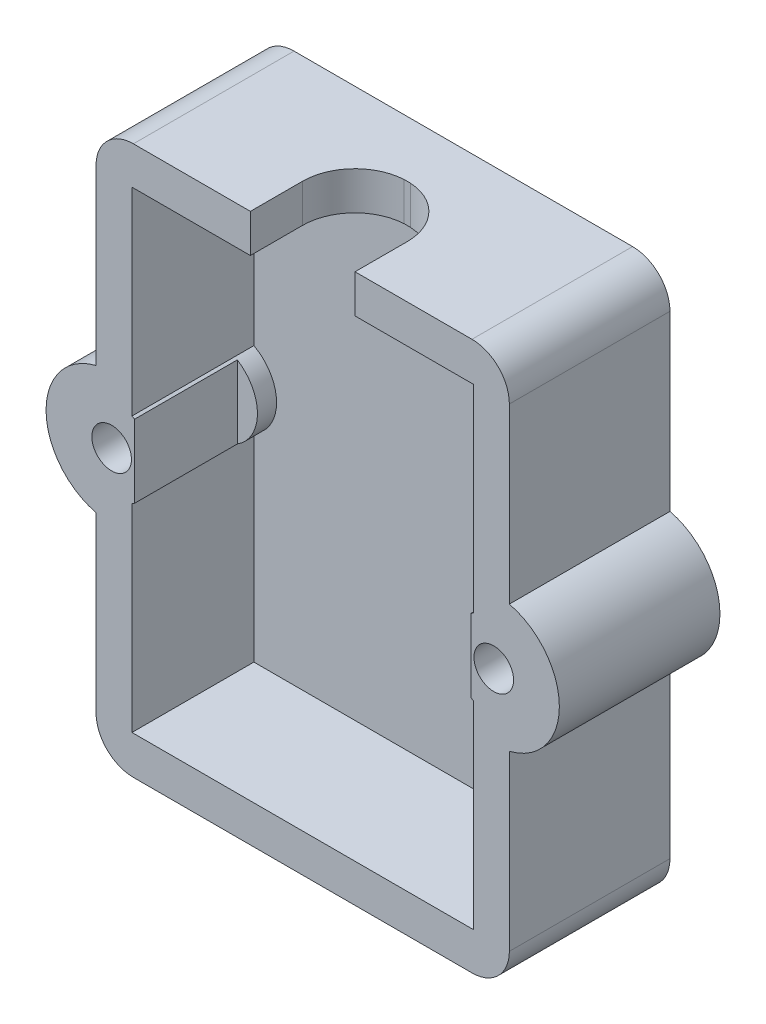
ISO-10303-21;
HEADER;
FILE_DESCRIPTION(('STEP AP214'),'2;1');
FILE_NAME('part.step','',(''),(''),'','','');
FILE_SCHEMA(('AUTOMOTIVE_DESIGN { 1 0 10303 214 1 1 1 1 }'));
ENDSEC;
DATA;
#1=APPLICATION_CONTEXT('core data for automotive mechanical design processes');
#2=APPLICATION_PROTOCOL_DEFINITION('international standard','automotive_design',2000,#1);
#3=PRODUCT_CONTEXT('',#1,'mechanical');
#4=PRODUCT('Part','Part','',(#3));
#5=PRODUCT_RELATED_PRODUCT_CATEGORY('part','',(#4));
#6=PRODUCT_DEFINITION_FORMATION('','',#4);
#7=PRODUCT_DEFINITION_CONTEXT('part definition',#1,'design');
#8=PRODUCT_DEFINITION('design','',#6,#7);
#9=PRODUCT_DEFINITION_SHAPE('','',#8);
#10=(LENGTH_UNIT() NAMED_UNIT(*) SI_UNIT(.MILLI.,.METRE.));
#11=(NAMED_UNIT(*) PLANE_ANGLE_UNIT() SI_UNIT($,.RADIAN.));
#12=(NAMED_UNIT(*) SI_UNIT($,.STERADIAN.) SOLID_ANGLE_UNIT());
#13=UNCERTAINTY_MEASURE_WITH_UNIT(LENGTH_MEASURE(1.E-05),#10,'distance_accuracy_value','');
#14=(GEOMETRIC_REPRESENTATION_CONTEXT(3) GLOBAL_UNCERTAINTY_ASSIGNED_CONTEXT((#13)) GLOBAL_UNIT_ASSIGNED_CONTEXT((#10,
#11,#12)) REPRESENTATION_CONTEXT('',''));
#15=CARTESIAN_POINT('',(0.,0.,0.));
#16=DIRECTION('',(0.,0.,1.));
#17=DIRECTION('',(1.,0.,0.));
#18=AXIS2_PLACEMENT_3D('',#15,#16,#17);
#19=CARTESIAN_POINT('',(-9.06,28.1835878256806,8.595));
#20=DIRECTION('',(0.,1.,0.));
#21=DIRECTION('',(-1.,0.,0.));
#22=AXIS2_PLACEMENT_3D('',#19,#20,#21);
#23=PLANE('',#22);
#24=CARTESIAN_POINT('',(0.,28.1835878256806,5.8));
#25=DIRECTION('',(0.,1.,0.));
#26=DIRECTION('',(0.,0.,1.));
#27=AXIS2_PLACEMENT_3D('',#24,#25,#26);
#28=CIRCLE('',#27,2.8);
#29=CARTESIAN_POINT('',(2.79999999999999,28.1835878256806,5.8));
#30=VERTEX_POINT('',#29);
#31=CARTESIAN_POINT('',(0.167257286836763,28.1835878256806,3.005));
#32=VERTEX_POINT('',#31);
#33=EDGE_CURVE('E437',#30,#32,#28,.T.);
#34=ORIENTED_EDGE('',*,*,#33,.F.);
#35=DIRECTION('',(0.,0.,1.));
#36=VECTOR('',#35,1.);
#37=CARTESIAN_POINT('',(2.79999999999999,28.1835878256806,0.));
#38=LINE('',#37,#36);
#39=CARTESIAN_POINT('',(2.79999999999999,28.1835878256806,8.595));
#40=VERTEX_POINT('',#39);
#41=EDGE_CURVE('E434',#30,#40,#38,.T.);
#42=ORIENTED_EDGE('',*,*,#41,.T.);
#43=DIRECTION('',(1.,0.,0.));
#44=VECTOR('',#43,1.);
#45=CARTESIAN_POINT('',(-9.06,28.1835878256806,8.595));
#46=LINE('',#45,#44);
#47=CARTESIAN_POINT('',(9.06,28.1835878256806,8.595));
#48=VERTEX_POINT('',#47);
#49=EDGE_CURVE('E313',#40,#48,#46,.T.);
#50=ORIENTED_EDGE('',*,*,#49,.T.);
#51=DIRECTION('',(0.,0.,-1.));
#52=VECTOR('',#51,1.);
#53=CARTESIAN_POINT('',(9.06,28.1835878256806,8.595));
#54=LINE('',#53,#52);
#55=CARTESIAN_POINT('',(9.06,28.1835878256806,0.));
#56=VERTEX_POINT('',#55);
#57=EDGE_CURVE('E398',#48,#56,#54,.T.);
#58=ORIENTED_EDGE('',*,*,#57,.T.);
#59=DIRECTION('',(1.,0.,0.));
#60=VECTOR('',#59,1.);
#61=CARTESIAN_POINT('',(-9.06,28.1835878256806,0.));
#62=LINE('',#61,#60);
#63=CARTESIAN_POINT('',(-9.06,28.1835878256806,0.));
#64=VERTEX_POINT('',#63);
#65=EDGE_CURVE('E346',#64,#56,#62,.T.);
#66=ORIENTED_EDGE('',*,*,#65,.F.);
#67=DIRECTION('',(0.,0.,-1.));
#68=VECTOR('',#67,1.);
#69=CARTESIAN_POINT('',(-9.06,28.1835878256806,8.595));
#70=LINE('',#69,#68);
#71=CARTESIAN_POINT('',(-9.06,28.1835878256806,8.595));
#72=VERTEX_POINT('',#71);
#73=EDGE_CURVE('E343',#72,#64,#70,.T.);
#74=ORIENTED_EDGE('',*,*,#73,.F.);
#75=CARTESIAN_POINT('',(-2.80000000000001,28.1835878256806,8.595));
#76=VERTEX_POINT('',#75);
#77=EDGE_CURVE('E315',#72,#76,#46,.T.);
#78=ORIENTED_EDGE('',*,*,#77,.T.);
#79=DIRECTION('',(0.,0.,1.));
#80=VECTOR('',#79,1.);
#81=CARTESIAN_POINT('',(-2.80000000000001,28.1835878256806,0.));
#82=LINE('',#81,#80);
#83=CARTESIAN_POINT('',(-2.80000000000001,28.1835878256806,5.8));
#84=VERTEX_POINT('',#83);
#85=EDGE_CURVE('E444',#84,#76,#82,.T.);
#86=ORIENTED_EDGE('',*,*,#85,.F.);
#87=CARTESIAN_POINT('',(-0.167257286836773,28.1835878256806,3.005));
#88=VERTEX_POINT('',#87);
#89=EDGE_CURVE('E441',#88,#84,#28,.T.);
#90=ORIENTED_EDGE('',*,*,#89,.F.);
#91=DIRECTION('',(1.,0.,0.));
#92=VECTOR('',#91,1.);
#93=CARTESIAN_POINT('',(0.,28.1835878256806,3.005));
#94=LINE('',#93,#92);
#95=EDGE_CURVE('E440',#88,#32,#94,.T.);
#96=ORIENTED_EDGE('',*,*,#95,.T.);
#97=EDGE_LOOP('',(#34,#42,#50,#58,#66,#74,#78,#86,#90,#96));
#98=FACE_BOUND('',#97,.T.);
#99=ADVANCED_FACE('F41',(#98),#23,.T.);
#100=CARTESIAN_POINT('',(-9.06,26.1835878256806,8.595));
#101=DIRECTION('',(0.,0.,-1.));
#102=DIRECTION('',(-1.,0.,0.));
#103=AXIS2_PLACEMENT_3D('',#100,#101,#102);
#104=PLANE('',#103);
#105=CARTESIAN_POINT('',(10.225,13.5,8.595));
#106=DIRECTION('',(0.,0.,1.));
#107=DIRECTION('',(-1.,0.,0.));
#108=AXIS2_PLACEMENT_3D('',#105,#106,#107);
#109=CIRCLE('',#108,1.06);
#110=CARTESIAN_POINT('',(9.165,13.5,8.595));
#111=VERTEX_POINT('',#110);
#112=EDGE_CURVE('E280',#111,#111,#109,.T.);
#113=ORIENTED_EDGE('',*,*,#112,.F.);
#114=EDGE_LOOP('',(#113));
#115=FACE_BOUND('',#114,.T.);
#116=CARTESIAN_POINT('',(-10.225,13.5,8.595));
#117=DIRECTION('',(0.,0.,1.));
#118=DIRECTION('',(1.,0.,0.));
#119=AXIS2_PLACEMENT_3D('',#116,#117,#118);
#120=CIRCLE('',#119,1.06);
#121=CARTESIAN_POINT('',(-9.165,13.5,8.595));
#122=VERTEX_POINT('',#121);
#123=EDGE_CURVE('E298',#122,#122,#120,.T.);
#124=ORIENTED_EDGE('',*,*,#123,.F.);
#125=EDGE_LOOP('',(#124));
#126=FACE_BOUND('',#125,.T.);
#127=CARTESIAN_POINT('',(10.225,13.5,8.595));
#128=DIRECTION('',(0.,0.,-1.));
#129=DIRECTION('',(-1.,0.,0.));
#130=AXIS2_PLACEMENT_3D('',#127,#128,#129);
#131=CIRCLE('',#130,2.30168504800674);
#132=CARTESIAN_POINT('',(9.,15.4486223493068,8.595));
#133=VERTEX_POINT('',#132);
#134=CARTESIAN_POINT('',(9.13750000000001,15.528570385818,8.595));
#135=VERTEX_POINT('',#134);
#136=EDGE_CURVE('E255',#133,#135,#131,.T.);
#137=ORIENTED_EDGE('',*,*,#136,.F.);
#138=DIRECTION('',(0.,1.,0.));
#139=VECTOR('',#138,1.);
#140=CARTESIAN_POINT('',(9.,1.22331959556489,8.595));
#141=LINE('',#140,#139);
#142=CARTESIAN_POINT('',(9.,11.5513776506932,8.595));
#143=VERTEX_POINT('',#142);
#144=EDGE_CURVE('E240',#143,#133,#141,.T.);
#145=ORIENTED_EDGE('',*,*,#144,.F.);
#146=CARTESIAN_POINT('',(9.1375,11.471429614182,8.595));
#147=VERTEX_POINT('',#146);
#148=EDGE_CURVE('E253',#147,#143,#131,.T.);
#149=ORIENTED_EDGE('',*,*,#148,.F.);
#150=DIRECTION('',(0.,1.,0.));
#151=VECTOR('',#150,1.);
#152=CARTESIAN_POINT('',(9.13750000000001,0.86141217431944,8.595));
#153=LINE('',#152,#151);
#154=CARTESIAN_POINT('',(9.13750000000001,0.86141217431944,8.595));
#155=VERTEX_POINT('',#154);
#156=EDGE_CURVE('E267',#155,#147,#153,.T.);
#157=ORIENTED_EDGE('',*,*,#156,.F.);
#158=DIRECTION('',(1.,0.,0.));
#159=VECTOR('',#158,1.);
#160=CARTESIAN_POINT('',(-9.1375,0.861412174319438,8.595));
#161=LINE('',#160,#159);
#162=CARTESIAN_POINT('',(-9.1375,0.861412174319438,8.595));
#163=VERTEX_POINT('',#162);
#164=EDGE_CURVE('E487',#163,#155,#161,.T.);
#165=ORIENTED_EDGE('',*,*,#164,.F.);
#166=DIRECTION('',(0.,-1.,0.));
#167=VECTOR('',#166,1.);
#168=CARTESIAN_POINT('',(-9.1375,0.861412174319438,8.595));
#169=LINE('',#168,#167);
#170=CARTESIAN_POINT('',(-9.1375,11.471429614182,8.595));
#171=VERTEX_POINT('',#170);
#172=EDGE_CURVE('E485',#171,#163,#169,.T.);
#173=ORIENTED_EDGE('',*,*,#172,.F.);
#174=CARTESIAN_POINT('',(-10.225,13.5,8.595));
#175=DIRECTION('',(0.,0.,-1.));
#176=DIRECTION('',(1.,0.,0.));
#177=AXIS2_PLACEMENT_3D('',#174,#175,#176);
#178=CIRCLE('',#177,2.30168504800674);
#179=CARTESIAN_POINT('',(-9.,11.5513776506932,8.595));
#180=VERTEX_POINT('',#179);
#181=EDGE_CURVE('E416',#180,#171,#178,.T.);
#182=ORIENTED_EDGE('',*,*,#181,.F.);
#183=DIRECTION('',(0.,-1.,0.));
#184=VECTOR('',#183,1.);
#185=CARTESIAN_POINT('',(-9.,1.22331959556489,8.595));
#186=LINE('',#185,#184);
#187=CARTESIAN_POINT('',(-9.,15.4486223493068,8.595));
#188=VERTEX_POINT('',#187);
#189=EDGE_CURVE('E256',#188,#180,#186,.T.);
#190=ORIENTED_EDGE('',*,*,#189,.F.);
#191=CARTESIAN_POINT('',(-9.1375,15.528570385818,8.595));
#192=VERTEX_POINT('',#191);
#193=EDGE_CURVE('E409',#192,#188,#178,.T.);
#194=ORIENTED_EDGE('',*,*,#193,.F.);
#195=DIRECTION('',(0.,-1.,0.));
#196=VECTOR('',#195,1.);
#197=CARTESIAN_POINT('',(-9.1375,15.528570385818,8.595));
#198=LINE('',#197,#196);
#199=CARTESIAN_POINT('',(-9.1375,26.1364121743194,8.595));
#200=VERTEX_POINT('',#199);
#201=EDGE_CURVE('E274',#200,#192,#198,.T.);
#202=ORIENTED_EDGE('',*,*,#201,.F.);
#203=DIRECTION('',(-1.,0.,0.));
#204=VECTOR('',#203,1.);
#205=CARTESIAN_POINT('',(-9.1375,26.1364121743194,8.595));
#206=LINE('',#205,#204);
#207=CARTESIAN_POINT('',(-2.80000000000001,26.1364121743194,8.595));
#208=VERTEX_POINT('',#207);
#209=EDGE_CURVE('E265',#208,#200,#206,.T.);
#210=ORIENTED_EDGE('',*,*,#209,.F.);
#211=DIRECTION('',(0.,1.,0.));
#212=VECTOR('',#211,1.);
#213=CARTESIAN_POINT('',(-2.80000000000001,-1.18458782568056,8.595));
#214=LINE('',#213,#212);
#215=EDGE_CURVE('E450',#208,#76,#214,.T.);
#216=ORIENTED_EDGE('',*,*,#215,.T.);
#217=ORIENTED_EDGE('',*,*,#77,.F.);
#218=CARTESIAN_POINT('',(-9.06,26.1835878256806,8.595));
#219=DIRECTION('',(0.,0.,-1.));
#220=DIRECTION('',(-1.,0.,0.));
#221=AXIS2_PLACEMENT_3D('',#218,#219,#220);
#222=CIRCLE('',#221,2.);
#223=CARTESIAN_POINT('',(-11.06,26.1835878256806,8.595));
#224=VERTEX_POINT('',#223);
#225=EDGE_CURVE('E310',#224,#72,#222,.T.);
#226=ORIENTED_EDGE('',*,*,#225,.F.);
#227=DIRECTION('',(0.,1.,0.));
#228=VECTOR('',#227,1.);
#229=CARTESIAN_POINT('',(-11.06,16.9092337848848,8.595));
#230=LINE('',#229,#228);
#231=CARTESIAN_POINT('',(-11.06,16.9092337848848,8.595));
#232=VERTEX_POINT('',#231);
#233=EDGE_CURVE('E340',#232,#224,#230,.T.);
#234=ORIENTED_EDGE('',*,*,#233,.F.);
#235=CARTESIAN_POINT('',(-10.225,13.5,8.595));
#236=DIRECTION('',(0.,0.,1.));
#237=DIRECTION('',(1.,0.,0.));
#238=AXIS2_PLACEMENT_3D('',#235,#236,#237);
#239=CIRCLE('',#238,3.51);
#240=CARTESIAN_POINT('',(-11.06,10.0907662151152,8.595));
#241=VERTEX_POINT('',#240);
#242=EDGE_CURVE('E338',#232,#241,#239,.T.);
#243=ORIENTED_EDGE('',*,*,#242,.T.);
#244=DIRECTION('',(0.,1.,0.));
#245=VECTOR('',#244,1.);
#246=CARTESIAN_POINT('',(-11.06,0.816412174319438,8.595));
#247=LINE('',#246,#245);
#248=CARTESIAN_POINT('',(-11.06,0.816412174319438,8.595));
#249=VERTEX_POINT('',#248);
#250=EDGE_CURVE('E335',#249,#241,#247,.T.);
#251=ORIENTED_EDGE('',*,*,#250,.F.);
#252=CARTESIAN_POINT('',(-9.06,0.816412174319438,8.595));
#253=DIRECTION('',(0.,0.,1.));
#254=DIRECTION('',(1.,0.,0.));
#255=AXIS2_PLACEMENT_3D('',#252,#253,#254);
#256=CIRCLE('',#255,2.);
#257=CARTESIAN_POINT('',(-9.06,-1.18358782568056,8.595));
#258=VERTEX_POINT('',#257);
#259=EDGE_CURVE('E333',#249,#258,#256,.T.);
#260=ORIENTED_EDGE('',*,*,#259,.T.);
#261=DIRECTION('',(1.,0.,0.));
#262=VECTOR('',#261,1.);
#263=CARTESIAN_POINT('',(-9.06,-1.18358782568056,8.595));
#264=LINE('',#263,#262);
#265=CARTESIAN_POINT('',(9.06,-1.18358782568056,8.595));
#266=VERTEX_POINT('',#265);
#267=EDGE_CURVE('E331',#258,#266,#264,.T.);
#268=ORIENTED_EDGE('',*,*,#267,.T.);
#269=CARTESIAN_POINT('',(9.06,0.816412174319441,8.595));
#270=DIRECTION('',(0.,0.,-1.));
#271=DIRECTION('',(-1.,0.,0.));
#272=AXIS2_PLACEMENT_3D('',#269,#270,#271);
#273=CIRCLE('',#272,2.);
#274=CARTESIAN_POINT('',(11.06,0.816412174319441,8.595));
#275=VERTEX_POINT('',#274);
#276=EDGE_CURVE('E328',#275,#266,#273,.T.);
#277=ORIENTED_EDGE('',*,*,#276,.F.);
#278=DIRECTION('',(0.,1.,0.));
#279=VECTOR('',#278,1.);
#280=CARTESIAN_POINT('',(11.06,0.816412174319441,8.595));
#281=LINE('',#280,#279);
#282=CARTESIAN_POINT('',(11.06,10.0907662151152,8.595));
#283=VERTEX_POINT('',#282);
#284=EDGE_CURVE('E326',#275,#283,#281,.T.);
#285=ORIENTED_EDGE('',*,*,#284,.T.);
#286=CARTESIAN_POINT('',(10.225,13.5,8.595));
#287=DIRECTION('',(0.,0.,-1.));
#288=DIRECTION('',(-1.,0.,0.));
#289=AXIS2_PLACEMENT_3D('',#286,#287,#288);
#290=CIRCLE('',#289,3.51000000000001);
#291=CARTESIAN_POINT('',(11.06,16.9092337848848,8.595));
#292=VERTEX_POINT('',#291);
#293=EDGE_CURVE('E323',#292,#283,#290,.T.);
#294=ORIENTED_EDGE('',*,*,#293,.F.);
#295=DIRECTION('',(0.,1.,0.));
#296=VECTOR('',#295,1.);
#297=CARTESIAN_POINT('',(11.06,16.9092337848848,8.595));
#298=LINE('',#297,#296);
#299=CARTESIAN_POINT('',(11.06,26.1835878256806,8.595));
#300=VERTEX_POINT('',#299);
#301=EDGE_CURVE('E321',#292,#300,#298,.T.);
#302=ORIENTED_EDGE('',*,*,#301,.T.);
#303=CARTESIAN_POINT('',(9.06,26.1835878256806,8.595));
#304=DIRECTION('',(0.,0.,-1.));
#305=DIRECTION('',(-1.,0.,0.));
#306=AXIS2_PLACEMENT_3D('',#303,#304,#305);
#307=CIRCLE('',#306,2.);
#308=EDGE_CURVE('E318',#48,#300,#307,.T.);
#309=ORIENTED_EDGE('',*,*,#308,.F.);
#310=ORIENTED_EDGE('',*,*,#49,.F.);
#311=DIRECTION('',(0.,1.,0.));
#312=VECTOR('',#311,1.);
#313=CARTESIAN_POINT('',(2.79999999999999,-1.18458782568056,8.595));
#314=LINE('',#313,#312);
#315=CARTESIAN_POINT('',(2.79999999999999,26.1364121743194,8.595));
#316=VERTEX_POINT('',#315);
#317=EDGE_CURVE('E447',#316,#40,#314,.T.);
#318=ORIENTED_EDGE('',*,*,#317,.F.);
#319=CARTESIAN_POINT('',(9.1375,26.1364121743194,8.595));
#320=VERTEX_POINT('',#319);
#321=EDGE_CURVE('E271',#320,#316,#206,.T.);
#322=ORIENTED_EDGE('',*,*,#321,.F.);
#323=DIRECTION('',(0.,1.,0.));
#324=VECTOR('',#323,1.);
#325=CARTESIAN_POINT('',(9.1375,15.528570385818,8.595));
#326=LINE('',#325,#324);
#327=EDGE_CURVE('E262',#135,#320,#326,.T.);
#328=ORIENTED_EDGE('',*,*,#327,.F.);
#329=EDGE_LOOP('',(#137,#145,#149,#157,#165,#173,#182,#190,#194,#202,#210,#216,#217,#226,#234,
#243,#251,#260,#268,#277,#285,#294,#302,#309,#310,#318,#322,#328));
#330=FACE_BOUND('',#329,.T.);
#331=ADVANCED_FACE('F251',(#115,#126,#330),#104,.F.);
#332=CARTESIAN_POINT('',(-9.1375,26.1364121743194,2.07));
#333=DIRECTION('',(0.,1.,0.));
#334=DIRECTION('',(-1.,0.,0.));
#335=AXIS2_PLACEMENT_3D('',#332,#333,#334);
#336=PLANE('',#335);
#337=DIRECTION('',(0.,0.,-1.));
#338=VECTOR('',#337,1.);
#339=CARTESIAN_POINT('',(2.79999999999999,26.1364121743194,0.));
#340=LINE('',#339,#338);
#341=CARTESIAN_POINT('',(2.79999999999999,26.1364121743194,5.8));
#342=VERTEX_POINT('',#341);
#343=EDGE_CURVE('E431',#316,#342,#340,.T.);
#344=ORIENTED_EDGE('',*,*,#343,.T.);
#345=CARTESIAN_POINT('',(0.,26.1364121743194,5.8));
#346=DIRECTION('',(0.,1.,0.));
#347=DIRECTION('',(-1.,0.,0.));
#348=AXIS2_PLACEMENT_3D('',#345,#346,#347);
#349=CIRCLE('',#348,2.8);
#350=CARTESIAN_POINT('',(0.167257286836763,26.1364121743194,3.005));
#351=VERTEX_POINT('',#350);
#352=EDGE_CURVE('E449',#351,#342,#349,.F.);
#353=ORIENTED_EDGE('',*,*,#352,.F.);
#354=DIRECTION('',(-1.,0.,0.));
#355=VECTOR('',#354,1.);
#356=CARTESIAN_POINT('',(0.,26.1364121743194,3.005));
#357=LINE('',#356,#355);
#358=CARTESIAN_POINT('',(-0.167257286836773,26.1364121743194,3.005));
#359=VERTEX_POINT('',#358);
#360=EDGE_CURVE('E422',#351,#359,#357,.T.);
#361=ORIENTED_EDGE('',*,*,#360,.T.);
#362=CARTESIAN_POINT('',(0.,26.1364121743194,5.8));
#363=DIRECTION('',(0.,1.,0.));
#364=DIRECTION('',(-1.,0.,0.));
#365=AXIS2_PLACEMENT_3D('',#362,#363,#364);
#366=CIRCLE('',#365,2.8);
#367=CARTESIAN_POINT('',(-2.80000000000001,26.1364121743194,5.8));
#368=VERTEX_POINT('',#367);
#369=EDGE_CURVE('E425',#368,#359,#366,.F.);
#370=ORIENTED_EDGE('',*,*,#369,.F.);
#371=DIRECTION('',(0.,0.,-1.));
#372=VECTOR('',#371,1.);
#373=CARTESIAN_POINT('',(-2.80000000000001,26.1364121743194,0.));
#374=LINE('',#373,#372);
#375=EDGE_CURVE('E428',#208,#368,#374,.T.);
#376=ORIENTED_EDGE('',*,*,#375,.F.);
#377=ORIENTED_EDGE('',*,*,#209,.T.);
#378=DIRECTION('',(0.,0.,1.));
#379=VECTOR('',#378,1.);
#380=CARTESIAN_POINT('',(-9.1375,26.1364121743194,2.07));
#381=LINE('',#380,#379);
#382=CARTESIAN_POINT('',(-9.1375,26.1364121743194,2.07));
#383=VERTEX_POINT('',#382);
#384=EDGE_CURVE('E281',#383,#200,#381,.T.);
#385=ORIENTED_EDGE('',*,*,#384,.F.);
#386=DIRECTION('',(-1.,0.,0.));
#387=VECTOR('',#386,1.);
#388=CARTESIAN_POINT('',(-9.1375,26.1364121743194,2.07));
#389=LINE('',#388,#387);
#390=CARTESIAN_POINT('',(9.1375,26.1364121743194,2.07));
#391=VERTEX_POINT('',#390);
#392=EDGE_CURVE('E479',#391,#383,#389,.T.);
#393=ORIENTED_EDGE('',*,*,#392,.F.);
#394=DIRECTION('',(0.,0.,1.));
#395=VECTOR('',#394,1.);
#396=CARTESIAN_POINT('',(9.1375,26.1364121743194,2.07));
#397=LINE('',#396,#395);
#398=EDGE_CURVE('E284',#391,#320,#397,.T.);
#399=ORIENTED_EDGE('',*,*,#398,.T.);
#400=ORIENTED_EDGE('',*,*,#321,.T.);
#401=EDGE_LOOP('',(#344,#353,#361,#370,#376,#377,#385,#393,#399,#400));
#402=FACE_BOUND('',#401,.T.);
#403=ADVANCED_FACE('F509',(#402),#336,.F.);
#404=CARTESIAN_POINT('',(-9.06,26.1835878256806,8.595));
#405=DIRECTION('',(0.,0.,-1.));
#406=DIRECTION('',(-1.,0.,0.));
#407=AXIS2_PLACEMENT_3D('',#404,#405,#406);
#408=CYLINDRICAL_SURFACE('',#407,2.);
#409=CARTESIAN_POINT('',(-9.06,26.1835878256806,0.));
#410=DIRECTION('',(0.,0.,-1.));
#411=DIRECTION('',(-1.,0.,0.));
#412=AXIS2_PLACEMENT_3D('',#409,#410,#411);
#413=CIRCLE('',#412,2.);
#414=CARTESIAN_POINT('',(-11.06,26.1835878256806,0.));
#415=VERTEX_POINT('',#414);
#416=EDGE_CURVE('E301',#415,#64,#413,.T.);
#417=ORIENTED_EDGE('',*,*,#416,.F.);
#418=DIRECTION('',(0.,0.,-1.));
#419=VECTOR('',#418,1.);
#420=CARTESIAN_POINT('',(-11.06,26.1835878256806,8.595));
#421=LINE('',#420,#419);
#422=EDGE_CURVE('E377',#224,#415,#421,.T.);
#423=ORIENTED_EDGE('',*,*,#422,.F.);
#424=ORIENTED_EDGE('',*,*,#225,.T.);
#425=ORIENTED_EDGE('',*,*,#73,.T.);
#426=EDGE_LOOP('',(#417,#423,#424,#425));
#427=FACE_BOUND('',#426,.T.);
#428=ADVANCED_FACE('F43',(#427),#408,.T.);
#429=CARTESIAN_POINT('',(-11.06,16.9092337848848,8.595));
#430=DIRECTION('',(-1.,0.,0.));
#431=DIRECTION('',(0.,-1.,0.));
#432=AXIS2_PLACEMENT_3D('',#429,#430,#431);
#433=PLANE('',#432);
#434=DIRECTION('',(0.,1.,0.));
#435=VECTOR('',#434,1.);
#436=CARTESIAN_POINT('',(-11.06,16.9092337848848,0.));
#437=LINE('',#436,#435);
#438=CARTESIAN_POINT('',(-11.06,16.9092337848848,0.));
#439=VERTEX_POINT('',#438);
#440=EDGE_CURVE('E314',#439,#415,#437,.T.);
#441=ORIENTED_EDGE('',*,*,#440,.F.);
#442=DIRECTION('',(0.,0.,-1.));
#443=VECTOR('',#442,1.);
#444=CARTESIAN_POINT('',(-11.06,16.9092337848848,8.595));
#445=LINE('',#444,#443);
#446=EDGE_CURVE('E379',#232,#439,#445,.T.);
#447=ORIENTED_EDGE('',*,*,#446,.F.);
#448=ORIENTED_EDGE('',*,*,#233,.T.);
#449=ORIENTED_EDGE('',*,*,#422,.T.);
#450=EDGE_LOOP('',(#441,#447,#448,#449));
#451=FACE_BOUND('',#450,.T.);
#452=ADVANCED_FACE('F525',(#451),#433,.T.);
#453=CARTESIAN_POINT('',(-10.225,13.5,8.595));
#454=DIRECTION('',(0.,0.,-1.));
#455=DIRECTION('',(-1.,0.,0.));
#456=AXIS2_PLACEMENT_3D('',#453,#454,#455);
#457=CYLINDRICAL_SURFACE('',#456,3.51);
#458=CARTESIAN_POINT('',(-10.225,13.5,0.));
#459=DIRECTION('',(0.,0.,1.));
#460=DIRECTION('',(1.,0.,0.));
#461=AXIS2_PLACEMENT_3D('',#458,#459,#460);
#462=CIRCLE('',#461,3.51);
#463=CARTESIAN_POINT('',(-11.06,10.0907662151152,0.));
#464=VERTEX_POINT('',#463);
#465=EDGE_CURVE('E372',#439,#464,#462,.T.);
#466=ORIENTED_EDGE('',*,*,#465,.T.);
#467=DIRECTION('',(0.,0.,-1.));
#468=VECTOR('',#467,1.);
#469=CARTESIAN_POINT('',(-11.06,10.0907662151152,8.595));
#470=LINE('',#469,#468);
#471=EDGE_CURVE('E381',#241,#464,#470,.T.);
#472=ORIENTED_EDGE('',*,*,#471,.F.);
#473=ORIENTED_EDGE('',*,*,#242,.F.);
#474=ORIENTED_EDGE('',*,*,#446,.T.);
#475=EDGE_LOOP('',(#466,#472,#473,#474));
#476=FACE_BOUND('',#475,.T.);
#477=ADVANCED_FACE('F530',(#476),#457,.T.);
#478=CARTESIAN_POINT('',(-11.06,0.816412174319438,8.595));
#479=DIRECTION('',(-1.,0.,0.));
#480=DIRECTION('',(0.,-1.,0.));
#481=AXIS2_PLACEMENT_3D('',#478,#479,#480);
#482=PLANE('',#481);
#483=DIRECTION('',(0.,1.,0.));
#484=VECTOR('',#483,1.);
#485=CARTESIAN_POINT('',(-11.06,0.816412174319438,0.));
#486=LINE('',#485,#484);
#487=CARTESIAN_POINT('',(-11.06,0.816412174319438,0.));
#488=VERTEX_POINT('',#487);
#489=EDGE_CURVE('E369',#488,#464,#486,.T.);
#490=ORIENTED_EDGE('',*,*,#489,.F.);
#491=DIRECTION('',(0.,0.,-1.));
#492=VECTOR('',#491,1.);
#493=CARTESIAN_POINT('',(-11.06,0.816412174319438,8.595));
#494=LINE('',#493,#492);
#495=EDGE_CURVE('E383',#249,#488,#494,.T.);
#496=ORIENTED_EDGE('',*,*,#495,.F.);
#497=ORIENTED_EDGE('',*,*,#250,.T.);
#498=ORIENTED_EDGE('',*,*,#471,.T.);
#499=EDGE_LOOP('',(#490,#496,#497,#498));
#500=FACE_BOUND('',#499,.T.);
#501=ADVANCED_FACE('F534',(#500),#482,.T.);
#502=CARTESIAN_POINT('',(-9.06,0.816412174319438,8.595));
#503=DIRECTION('',(0.,0.,-1.));
#504=DIRECTION('',(-1.,0.,0.));
#505=AXIS2_PLACEMENT_3D('',#502,#503,#504);
#506=CYLINDRICAL_SURFACE('',#505,2.);
#507=CARTESIAN_POINT('',(-9.06,0.816412174319438,0.));
#508=DIRECTION('',(0.,0.,1.));
#509=DIRECTION('',(1.,0.,0.));
#510=AXIS2_PLACEMENT_3D('',#507,#508,#509);
#511=CIRCLE('',#510,2.);
#512=CARTESIAN_POINT('',(-9.06,-1.18358782568056,0.));
#513=VERTEX_POINT('',#512);
#514=EDGE_CURVE('E367',#488,#513,#511,.T.);
#515=ORIENTED_EDGE('',*,*,#514,.T.);
#516=DIRECTION('',(0.,0.,-1.));
#517=VECTOR('',#516,1.);
#518=CARTESIAN_POINT('',(-9.06,-1.18358782568056,8.595));
#519=LINE('',#518,#517);
#520=EDGE_CURVE('E385',#258,#513,#519,.T.);
#521=ORIENTED_EDGE('',*,*,#520,.F.);
#522=ORIENTED_EDGE('',*,*,#259,.F.);
#523=ORIENTED_EDGE('',*,*,#495,.T.);
#524=EDGE_LOOP('',(#515,#521,#522,#523));
#525=FACE_BOUND('',#524,.T.);
#526=ADVANCED_FACE('F539',(#525),#506,.T.);
#527=CARTESIAN_POINT('',(-9.06,-1.18358782568056,8.595));
#528=DIRECTION('',(0.,1.,0.));
#529=DIRECTION('',(-1.,0.,0.));
#530=AXIS2_PLACEMENT_3D('',#527,#528,#529);
#531=PLANE('',#530);
#532=DIRECTION('',(1.,0.,0.));
#533=VECTOR('',#532,1.);
#534=CARTESIAN_POINT('',(-9.06,-1.18358782568056,0.));
#535=LINE('',#534,#533);
#536=CARTESIAN_POINT('',(9.06,-1.18358782568056,0.));
#537=VERTEX_POINT('',#536);
#538=EDGE_CURVE('E364',#513,#537,#535,.T.);
#539=ORIENTED_EDGE('',*,*,#538,.T.);
#540=DIRECTION('',(0.,0.,-1.));
#541=VECTOR('',#540,1.);
#542=CARTESIAN_POINT('',(9.06,-1.18358782568056,8.595));
#543=LINE('',#542,#541);
#544=EDGE_CURVE('E388',#266,#537,#543,.T.);
#545=ORIENTED_EDGE('',*,*,#544,.F.);
#546=ORIENTED_EDGE('',*,*,#267,.F.);
#547=ORIENTED_EDGE('',*,*,#520,.T.);
#548=EDGE_LOOP('',(#539,#545,#546,#547));
#549=FACE_BOUND('',#548,.T.);
#550=ADVANCED_FACE('F544',(#549),#531,.F.);
#551=CARTESIAN_POINT('',(9.06,0.816412174319441,8.595));
#552=DIRECTION('',(0.,0.,-1.));
#553=DIRECTION('',(-1.,0.,0.));
#554=AXIS2_PLACEMENT_3D('',#551,#552,#553);
#555=CYLINDRICAL_SURFACE('',#554,2.);
#556=CARTESIAN_POINT('',(9.06,0.816412174319441,0.));
#557=DIRECTION('',(0.,0.,-1.));
#558=DIRECTION('',(-1.,0.,0.));
#559=AXIS2_PLACEMENT_3D('',#556,#557,#558);
#560=CIRCLE('',#559,2.);
#561=CARTESIAN_POINT('',(11.06,0.816412174319441,0.));
#562=VERTEX_POINT('',#561);
#563=EDGE_CURVE('E361',#562,#537,#560,.T.);
#564=ORIENTED_EDGE('',*,*,#563,.F.);
#565=DIRECTION('',(0.,0.,-1.));
#566=VECTOR('',#565,1.);
#567=CARTESIAN_POINT('',(11.06,0.816412174319441,8.595));
#568=LINE('',#567,#566);
#569=EDGE_CURVE('E390',#275,#562,#568,.T.);
#570=ORIENTED_EDGE('',*,*,#569,.F.);
#571=ORIENTED_EDGE('',*,*,#276,.T.);
#572=ORIENTED_EDGE('',*,*,#544,.T.);
#573=EDGE_LOOP('',(#564,#570,#571,#572));
#574=FACE_BOUND('',#573,.T.);
#575=ADVANCED_FACE('F548',(#574),#555,.T.);
#576=CARTESIAN_POINT('',(11.06,0.816412174319441,8.595));
#577=DIRECTION('',(-1.,0.,0.));
#578=DIRECTION('',(0.,-1.,0.));
#579=AXIS2_PLACEMENT_3D('',#576,#577,#578);
#580=PLANE('',#579);
#581=DIRECTION('',(0.,1.,0.));
#582=VECTOR('',#581,1.);
#583=CARTESIAN_POINT('',(11.06,0.816412174319441,0.));
#584=LINE('',#583,#582);
#585=CARTESIAN_POINT('',(11.06,10.0907662151152,0.));
#586=VERTEX_POINT('',#585);
#587=EDGE_CURVE('E358',#562,#586,#584,.T.);
#588=ORIENTED_EDGE('',*,*,#587,.T.);
#589=DIRECTION('',(0.,0.,-1.));
#590=VECTOR('',#589,1.);
#591=CARTESIAN_POINT('',(11.06,10.0907662151152,8.595));
#592=LINE('',#591,#590);
#593=EDGE_CURVE('E392',#283,#586,#592,.T.);
#594=ORIENTED_EDGE('',*,*,#593,.F.);
#595=ORIENTED_EDGE('',*,*,#284,.F.);
#596=ORIENTED_EDGE('',*,*,#569,.T.);
#597=EDGE_LOOP('',(#588,#594,#595,#596));
#598=FACE_BOUND('',#597,.T.);
#599=ADVANCED_FACE('F553',(#598),#580,.F.);
#600=CARTESIAN_POINT('',(10.225,13.5,8.595));
#601=DIRECTION('',(0.,0.,-1.));
#602=DIRECTION('',(-1.,0.,0.));
#603=AXIS2_PLACEMENT_3D('',#600,#601,#602);
#604=CYLINDRICAL_SURFACE('',#603,3.51000000000001);
#605=CARTESIAN_POINT('',(10.225,13.5,0.));
#606=DIRECTION('',(0.,0.,-1.));
#607=DIRECTION('',(-1.,0.,0.));
#608=AXIS2_PLACEMENT_3D('',#605,#606,#607);
#609=CIRCLE('',#608,3.51000000000001);
#610=CARTESIAN_POINT('',(11.06,16.9092337848848,0.));
#611=VERTEX_POINT('',#610);
#612=EDGE_CURVE('E355',#611,#586,#609,.T.);
#613=ORIENTED_EDGE('',*,*,#612,.F.);
#614=DIRECTION('',(0.,0.,-1.));
#615=VECTOR('',#614,1.);
#616=CARTESIAN_POINT('',(11.06,16.9092337848848,8.595));
#617=LINE('',#616,#615);
#618=EDGE_CURVE('E394',#292,#611,#617,.T.);
#619=ORIENTED_EDGE('',*,*,#618,.F.);
#620=ORIENTED_EDGE('',*,*,#293,.T.);
#621=ORIENTED_EDGE('',*,*,#593,.T.);
#622=EDGE_LOOP('',(#613,#619,#620,#621));
#623=FACE_BOUND('',#622,.T.);
#624=ADVANCED_FACE('F560',(#623),#604,.T.);
#625=CARTESIAN_POINT('',(11.06,16.9092337848848,8.595));
#626=DIRECTION('',(-1.,0.,0.));
#627=DIRECTION('',(0.,-1.,0.));
#628=AXIS2_PLACEMENT_3D('',#625,#626,#627);
#629=PLANE('',#628);
#630=DIRECTION('',(0.,1.,0.));
#631=VECTOR('',#630,1.);
#632=CARTESIAN_POINT('',(11.06,16.9092337848848,0.));
#633=LINE('',#632,#631);
#634=CARTESIAN_POINT('',(11.06,26.1835878256806,0.));
#635=VERTEX_POINT('',#634);
#636=EDGE_CURVE('E352',#611,#635,#633,.T.);
#637=ORIENTED_EDGE('',*,*,#636,.T.);
#638=DIRECTION('',(0.,0.,-1.));
#639=VECTOR('',#638,1.);
#640=CARTESIAN_POINT('',(11.06,26.1835878256806,8.595));
#641=LINE('',#640,#639);
#642=EDGE_CURVE('E396',#300,#635,#641,.T.);
#643=ORIENTED_EDGE('',*,*,#642,.F.);
#644=ORIENTED_EDGE('',*,*,#301,.F.);
#645=ORIENTED_EDGE('',*,*,#618,.T.);
#646=EDGE_LOOP('',(#637,#643,#644,#645));
#647=FACE_BOUND('',#646,.T.);
#648=ADVANCED_FACE('F563',(#647),#629,.F.);
#649=CARTESIAN_POINT('',(9.06,26.1835878256806,8.595));
#650=DIRECTION('',(0.,0.,-1.));
#651=DIRECTION('',(-1.,0.,0.));
#652=AXIS2_PLACEMENT_3D('',#649,#650,#651);
#653=CYLINDRICAL_SURFACE('',#652,2.);
#654=CARTESIAN_POINT('',(9.06,26.1835878256806,0.));
#655=DIRECTION('',(0.,0.,-1.));
#656=DIRECTION('',(-1.,0.,0.));
#657=AXIS2_PLACEMENT_3D('',#654,#655,#656);
#658=CIRCLE('',#657,2.);
#659=EDGE_CURVE('E349',#56,#635,#658,.T.);
#660=ORIENTED_EDGE('',*,*,#659,.F.);
#661=ORIENTED_EDGE('',*,*,#57,.F.);
#662=ORIENTED_EDGE('',*,*,#308,.T.);
#663=ORIENTED_EDGE('',*,*,#642,.T.);
#664=EDGE_LOOP('',(#660,#661,#662,#663));
#665=FACE_BOUND('',#664,.T.);
#666=ADVANCED_FACE('F567',(#665),#653,.T.);
#667=CARTESIAN_POINT('',(-9.06,26.1835878256806,0.));
#668=DIRECTION('',(0.,0.,-1.));
#669=DIRECTION('',(-1.,0.,0.));
#670=AXIS2_PLACEMENT_3D('',#667,#668,#669);
#671=PLANE('',#670);
#672=CARTESIAN_POINT('',(-10.225,13.5,0.));
#673=DIRECTION('',(0.,0.,-1.));
#674=DIRECTION('',(-1.,0.,0.));
#675=AXIS2_PLACEMENT_3D('',#672,#673,#674);
#676=CIRCLE('',#675,1.06);
#677=CARTESIAN_POINT('',(-11.285,13.5,0.));
#678=VERTEX_POINT('',#677);
#679=EDGE_CURVE('E302',#678,#678,#676,.F.);
#680=ORIENTED_EDGE('',*,*,#679,.T.);
#681=EDGE_LOOP('',(#680));
#682=FACE_BOUND('',#681,.T.);
#683=CARTESIAN_POINT('',(10.225,13.5,0.));
#684=DIRECTION('',(0.,0.,-1.));
#685=DIRECTION('',(-1.,0.,0.));
#686=AXIS2_PLACEMENT_3D('',#683,#684,#685);
#687=CIRCLE('',#686,1.06);
#688=CARTESIAN_POINT('',(9.165,13.5,0.));
#689=VERTEX_POINT('',#688);
#690=EDGE_CURVE('E305',#689,#689,#687,.F.);
#691=ORIENTED_EDGE('',*,*,#690,.T.);
#692=EDGE_LOOP('',(#691));
#693=FACE_BOUND('',#692,.T.);
#694=ORIENTED_EDGE('',*,*,#416,.T.);
#695=ORIENTED_EDGE('',*,*,#65,.T.);
#696=ORIENTED_EDGE('',*,*,#659,.T.);
#697=ORIENTED_EDGE('',*,*,#636,.F.);
#698=ORIENTED_EDGE('',*,*,#612,.T.);
#699=ORIENTED_EDGE('',*,*,#587,.F.);
#700=ORIENTED_EDGE('',*,*,#563,.T.);
#701=ORIENTED_EDGE('',*,*,#538,.F.);
#702=ORIENTED_EDGE('',*,*,#514,.F.);
#703=ORIENTED_EDGE('',*,*,#489,.T.);
#704=ORIENTED_EDGE('',*,*,#465,.F.);
#705=ORIENTED_EDGE('',*,*,#440,.T.);
#706=EDGE_LOOP('',(#694,#695,#696,#697,#698,#699,#700,#701,#702,#703,#704,#705));
#707=FACE_BOUND('',#706,.T.);
#708=ADVANCED_FACE('F606',(#682,#693,#707),#671,.T.);
#709=CARTESIAN_POINT('',(10.225,13.5,-0.000999999999999265));
#710=DIRECTION('',(0.,0.,1.));
#711=DIRECTION('',(1.,0.,0.));
#712=AXIS2_PLACEMENT_3D('',#709,#710,#711);
#713=CYLINDRICAL_SURFACE('',#712,1.06);
#714=ORIENTED_EDGE('',*,*,#690,.F.);
#715=EDGE_LOOP('',(#714));
#716=FACE_BOUND('',#715,.T.);
#717=ORIENTED_EDGE('',*,*,#112,.T.);
#718=EDGE_LOOP('',(#717));
#719=FACE_BOUND('',#718,.T.);
#720=ADVANCED_FACE('F626',(#716,#719),#713,.F.);
#721=CARTESIAN_POINT('',(-10.225,13.5,-0.000999999999999265));
#722=DIRECTION('',(0.,0.,1.));
#723=DIRECTION('',(1.,0.,0.));
#724=AXIS2_PLACEMENT_3D('',#721,#722,#723);
#725=CYLINDRICAL_SURFACE('',#724,1.06);
#726=ORIENTED_EDGE('',*,*,#679,.F.);
#727=EDGE_LOOP('',(#726));
#728=FACE_BOUND('',#727,.T.);
#729=ORIENTED_EDGE('',*,*,#123,.T.);
#730=EDGE_LOOP('',(#729));
#731=FACE_BOUND('',#730,.T.);
#732=ADVANCED_FACE('F631',(#728,#731),#725,.F.);
#733=CARTESIAN_POINT('',(-10.225,13.5,2.07));
#734=DIRECTION('',(0.,0.,1.));
#735=DIRECTION('',(1.,0.,0.));
#736=AXIS2_PLACEMENT_3D('',#733,#734,#735);
#737=CYLINDRICAL_SURFACE('',#736,2.30168504800674);
#738=CARTESIAN_POINT('',(-10.225,13.5,3.095));
#739=DIRECTION('',(0.,0.,-1.));
#740=DIRECTION('',(-1.,0.,0.));
#741=AXIS2_PLACEMENT_3D('',#738,#739,#740);
#742=CIRCLE('',#741,2.30168504800674);
#743=CARTESIAN_POINT('',(-9.,15.4486223493068,3.095));
#744=VERTEX_POINT('',#743);
#745=CARTESIAN_POINT('',(-9.,11.5513776506932,3.095));
#746=VERTEX_POINT('',#745);
#747=EDGE_CURVE('E407',#744,#746,#742,.T.);
#748=ORIENTED_EDGE('',*,*,#747,.T.);
#749=DIRECTION('',(0.,0.,1.));
#750=VECTOR('',#749,1.);
#751=CARTESIAN_POINT('',(-9.,11.5513776506932,2.07));
#752=LINE('',#751,#750);
#753=EDGE_CURVE('E11',#746,#180,#752,.T.);
#754=ORIENTED_EDGE('',*,*,#753,.T.);
#755=ORIENTED_EDGE('',*,*,#181,.T.);
#756=DIRECTION('',(0.,0.,1.));
#757=VECTOR('',#756,1.);
#758=CARTESIAN_POINT('',(-9.1375,11.471429614182,2.07));
#759=LINE('',#758,#757);
#760=CARTESIAN_POINT('',(-9.1375,11.471429614182,2.07));
#761=VERTEX_POINT('',#760);
#762=EDGE_CURVE('E294',#761,#171,#759,.T.);
#763=ORIENTED_EDGE('',*,*,#762,.F.);
#764=CARTESIAN_POINT('',(-10.225,13.5,2.07));
#765=DIRECTION('',(0.,0.,-1.));
#766=DIRECTION('',(1.,0.,0.));
#767=AXIS2_PLACEMENT_3D('',#764,#765,#766);
#768=CIRCLE('',#767,2.30168504800674);
#769=CARTESIAN_POINT('',(-9.1375,15.528570385818,2.07));
#770=VERTEX_POINT('',#769);
#771=EDGE_CURVE('E277',#770,#761,#768,.T.);
#772=ORIENTED_EDGE('',*,*,#771,.F.);
#773=DIRECTION('',(0.,0.,1.));
#774=VECTOR('',#773,1.);
#775=CARTESIAN_POINT('',(-9.1375,15.528570385818,2.07));
#776=LINE('',#775,#774);
#777=EDGE_CURVE('E278',#770,#192,#776,.T.);
#778=ORIENTED_EDGE('',*,*,#777,.T.);
#779=ORIENTED_EDGE('',*,*,#193,.T.);
#780=DIRECTION('',(0.,0.,1.));
#781=VECTOR('',#780,1.);
#782=CARTESIAN_POINT('',(-9.,15.4486223493068,2.07));
#783=LINE('',#782,#781);
#784=EDGE_CURVE('E49',#188,#744,#783,.F.);
#785=ORIENTED_EDGE('',*,*,#784,.T.);
#786=EDGE_LOOP('',(#748,#754,#755,#763,#772,#778,#779,#785));
#787=FACE_BOUND('',#786,.T.);
#788=ADVANCED_FACE('F406',(#787),#737,.T.);
#789=CARTESIAN_POINT('',(-9.1375,15.528570385818,2.07));
#790=DIRECTION('',(-1.,0.,0.));
#791=DIRECTION('',(0.,0.,1.));
#792=AXIS2_PLACEMENT_3D('',#789,#790,#791);
#793=PLANE('',#792);
#794=ORIENTED_EDGE('',*,*,#201,.T.);
#795=ORIENTED_EDGE('',*,*,#777,.F.);
#796=DIRECTION('',(0.,-1.,0.));
#797=VECTOR('',#796,1.);
#798=CARTESIAN_POINT('',(-9.1375,15.528570385818,2.07));
#799=LINE('',#798,#797);
#800=EDGE_CURVE('E297',#383,#770,#799,.T.);
#801=ORIENTED_EDGE('',*,*,#800,.F.);
#802=ORIENTED_EDGE('',*,*,#384,.T.);
#803=EDGE_LOOP('',(#794,#795,#801,#802));
#804=FACE_BOUND('',#803,.T.);
#805=ADVANCED_FACE('F504',(#804),#793,.F.);
#806=CARTESIAN_POINT('',(9.1375,15.528570385818,2.07));
#807=DIRECTION('',(1.,0.,0.));
#808=DIRECTION('',(0.,1.,0.));
#809=AXIS2_PLACEMENT_3D('',#806,#807,#808);
#810=PLANE('',#809);
#811=ORIENTED_EDGE('',*,*,#327,.T.);
#812=ORIENTED_EDGE('',*,*,#398,.F.);
#813=DIRECTION('',(0.,1.,0.));
#814=VECTOR('',#813,1.);
#815=CARTESIAN_POINT('',(9.1375,15.528570385818,2.07));
#816=LINE('',#815,#814);
#817=CARTESIAN_POINT('',(9.13750000000001,15.528570385818,2.07));
#818=VERTEX_POINT('',#817);
#819=EDGE_CURVE('E476',#818,#391,#816,.T.);
#820=ORIENTED_EDGE('',*,*,#819,.F.);
#821=DIRECTION('',(0.,0.,1.));
#822=VECTOR('',#821,1.);
#823=CARTESIAN_POINT('',(9.13750000000001,15.528570385818,2.07));
#824=LINE('',#823,#822);
#825=EDGE_CURVE('E286',#818,#135,#824,.T.);
#826=ORIENTED_EDGE('',*,*,#825,.T.);
#827=EDGE_LOOP('',(#811,#812,#820,#826));
#828=FACE_BOUND('',#827,.T.);
#829=ADVANCED_FACE('F576',(#828),#810,.F.);
#830=CARTESIAN_POINT('',(10.225,13.5,2.07));
#831=DIRECTION('',(0.,0.,1.));
#832=DIRECTION('',(1.,0.,0.));
#833=AXIS2_PLACEMENT_3D('',#830,#831,#832);
#834=CYLINDRICAL_SURFACE('',#833,2.30168504800674);
#835=CARTESIAN_POINT('',(10.225,13.5,3.095));
#836=DIRECTION('',(0.,0.,-1.));
#837=DIRECTION('',(-1.,0.,0.));
#838=AXIS2_PLACEMENT_3D('',#835,#836,#837);
#839=CIRCLE('',#838,2.30168504800674);
#840=CARTESIAN_POINT('',(9.,11.5513776506932,3.095));
#841=VERTEX_POINT('',#840);
#842=CARTESIAN_POINT('',(9.,15.4486223493068,3.095));
#843=VERTEX_POINT('',#842);
#844=EDGE_CURVE('E246',#841,#843,#839,.T.);
#845=ORIENTED_EDGE('',*,*,#844,.T.);
#846=DIRECTION('',(0.,0.,1.));
#847=VECTOR('',#846,1.);
#848=CARTESIAN_POINT('',(9.,15.4486223493068,2.07));
#849=LINE('',#848,#847);
#850=EDGE_CURVE('E245',#843,#133,#849,.T.);
#851=ORIENTED_EDGE('',*,*,#850,.T.);
#852=ORIENTED_EDGE('',*,*,#136,.T.);
#853=ORIENTED_EDGE('',*,*,#825,.F.);
#854=CARTESIAN_POINT('',(10.225,13.5,2.07));
#855=DIRECTION('',(0.,0.,-1.));
#856=DIRECTION('',(-1.,0.,0.));
#857=AXIS2_PLACEMENT_3D('',#854,#855,#856);
#858=CIRCLE('',#857,2.30168504800674);
#859=CARTESIAN_POINT('',(9.1375,11.471429614182,2.07));
#860=VERTEX_POINT('',#859);
#861=EDGE_CURVE('E473',#860,#818,#858,.T.);
#862=ORIENTED_EDGE('',*,*,#861,.F.);
#863=DIRECTION('',(0.,0.,1.));
#864=VECTOR('',#863,1.);
#865=CARTESIAN_POINT('',(9.1375,11.471429614182,2.07));
#866=LINE('',#865,#864);
#867=EDGE_CURVE('E260',#860,#147,#866,.T.);
#868=ORIENTED_EDGE('',*,*,#867,.T.);
#869=ORIENTED_EDGE('',*,*,#148,.T.);
#870=DIRECTION('',(0.,0.,1.));
#871=VECTOR('',#870,1.);
#872=CARTESIAN_POINT('',(9.,11.5513776506932,2.07));
#873=LINE('',#872,#871);
#874=EDGE_CURVE('E237',#143,#841,#873,.F.);
#875=ORIENTED_EDGE('',*,*,#874,.T.);
#876=EDGE_LOOP('',(#845,#851,#852,#853,#862,#868,#869,#875));
#877=FACE_BOUND('',#876,.T.);
#878=ADVANCED_FACE('F258',(#877),#834,.T.);
#879=CARTESIAN_POINT('',(9.13750000000001,0.86141217431944,2.07));
#880=DIRECTION('',(1.,0.,0.));
#881=DIRECTION('',(0.,1.,0.));
#882=AXIS2_PLACEMENT_3D('',#879,#880,#881);
#883=PLANE('',#882);
#884=ORIENTED_EDGE('',*,*,#156,.T.);
#885=ORIENTED_EDGE('',*,*,#867,.F.);
#886=DIRECTION('',(0.,1.,0.));
#887=VECTOR('',#886,1.);
#888=CARTESIAN_POINT('',(9.13750000000001,0.86141217431944,2.07));
#889=LINE('',#888,#887);
#890=CARTESIAN_POINT('',(9.13750000000001,0.86141217431944,2.07));
#891=VERTEX_POINT('',#890);
#892=EDGE_CURVE('E470',#891,#860,#889,.T.);
#893=ORIENTED_EDGE('',*,*,#892,.F.);
#894=DIRECTION('',(0.,0.,1.));
#895=VECTOR('',#894,1.);
#896=CARTESIAN_POINT('',(9.13750000000001,0.86141217431944,2.07));
#897=LINE('',#896,#895);
#898=EDGE_CURVE('E290',#891,#155,#897,.T.);
#899=ORIENTED_EDGE('',*,*,#898,.T.);
#900=EDGE_LOOP('',(#884,#885,#893,#899));
#901=FACE_BOUND('',#900,.T.);
#902=ADVANCED_FACE('F492',(#901),#883,.F.);
#903=CARTESIAN_POINT('',(-9.1375,0.861412174319438,2.07));
#904=DIRECTION('',(0.,-1.,0.));
#905=DIRECTION('',(1.,0.,0.));
#906=AXIS2_PLACEMENT_3D('',#903,#904,#905);
#907=PLANE('',#906);
#908=ORIENTED_EDGE('',*,*,#164,.T.);
#909=ORIENTED_EDGE('',*,*,#898,.F.);
#910=DIRECTION('',(1.,0.,0.));
#911=VECTOR('',#910,1.);
#912=CARTESIAN_POINT('',(-9.1375,0.861412174319438,2.07));
#913=LINE('',#912,#911);
#914=CARTESIAN_POINT('',(-9.1375,0.861412174319438,2.07));
#915=VERTEX_POINT('',#914);
#916=EDGE_CURVE('E467',#915,#891,#913,.T.);
#917=ORIENTED_EDGE('',*,*,#916,.F.);
#918=DIRECTION('',(0.,0.,1.));
#919=VECTOR('',#918,1.);
#920=CARTESIAN_POINT('',(-9.1375,0.861412174319438,2.07));
#921=LINE('',#920,#919);
#922=EDGE_CURVE('E292',#915,#163,#921,.T.);
#923=ORIENTED_EDGE('',*,*,#922,.T.);
#924=EDGE_LOOP('',(#908,#909,#917,#923));
#925=FACE_BOUND('',#924,.T.);
#926=ADVANCED_FACE('F640',(#925),#907,.F.);
#927=CARTESIAN_POINT('',(-9.1375,0.861412174319438,2.07));
#928=DIRECTION('',(-1.,0.,0.));
#929=DIRECTION('',(0.,0.,1.));
#930=AXIS2_PLACEMENT_3D('',#927,#928,#929);
#931=PLANE('',#930);
#932=ORIENTED_EDGE('',*,*,#172,.T.);
#933=ORIENTED_EDGE('',*,*,#922,.F.);
#934=DIRECTION('',(0.,-1.,0.));
#935=VECTOR('',#934,1.);
#936=CARTESIAN_POINT('',(-9.1375,0.861412174319438,2.07));
#937=LINE('',#936,#935);
#938=EDGE_CURVE('E464',#761,#915,#937,.T.);
#939=ORIENTED_EDGE('',*,*,#938,.F.);
#940=ORIENTED_EDGE('',*,*,#762,.T.);
#941=EDGE_LOOP('',(#932,#933,#939,#940));
#942=FACE_BOUND('',#941,.T.);
#943=ADVANCED_FACE('F495',(#942),#931,.F.);
#944=CARTESIAN_POINT('',(-10.225,13.5,2.07));
#945=DIRECTION('',(0.,0.,1.));
#946=DIRECTION('',(1.,0.,0.));
#947=AXIS2_PLACEMENT_3D('',#944,#945,#946);
#948=PLANE('',#947);
#949=ORIENTED_EDGE('',*,*,#771,.T.);
#950=ORIENTED_EDGE('',*,*,#938,.T.);
#951=ORIENTED_EDGE('',*,*,#916,.T.);
#952=ORIENTED_EDGE('',*,*,#892,.T.);
#953=ORIENTED_EDGE('',*,*,#861,.T.);
#954=ORIENTED_EDGE('',*,*,#819,.T.);
#955=ORIENTED_EDGE('',*,*,#392,.T.);
#956=ORIENTED_EDGE('',*,*,#800,.T.);
#957=EDGE_LOOP('',(#949,#950,#951,#952,#953,#954,#955,#956));
#958=FACE_BOUND('',#957,.T.);
#959=ADVANCED_FACE('F501',(#958),#948,.T.);
#960=CARTESIAN_POINT('',(2.79999999999999,-1.18458782568056,0.));
#961=DIRECTION('',(-1.,0.,0.));
#962=DIRECTION('',(0.,0.,1.));
#963=AXIS2_PLACEMENT_3D('',#960,#961,#962);
#964=PLANE('',#963);
#965=ORIENTED_EDGE('',*,*,#317,.T.);
#966=ORIENTED_EDGE('',*,*,#41,.F.);
#967=DIRECTION('',(0.,1.,0.));
#968=VECTOR('',#967,1.);
#969=CARTESIAN_POINT('',(2.79999999999999,-1.18458782568056,5.8));
#970=LINE('',#969,#968);
#971=EDGE_CURVE('E446',#342,#30,#970,.T.);
#972=ORIENTED_EDGE('',*,*,#971,.F.);
#973=ORIENTED_EDGE('',*,*,#343,.F.);
#974=EDGE_LOOP('',(#965,#966,#972,#973));
#975=FACE_BOUND('',#974,.T.);
#976=ADVANCED_FACE('F573',(#975),#964,.T.);
#977=CARTESIAN_POINT('',(-2.80000000000001,-1.18458782568056,0.));
#978=DIRECTION('',(-1.,0.,0.));
#979=DIRECTION('',(0.,0.,1.));
#980=AXIS2_PLACEMENT_3D('',#977,#978,#979);
#981=PLANE('',#980);
#982=ORIENTED_EDGE('',*,*,#375,.T.);
#983=DIRECTION('',(0.,1.,0.));
#984=VECTOR('',#983,1.);
#985=CARTESIAN_POINT('',(-2.80000000000001,-1.18458782568056,5.8));
#986=LINE('',#985,#984);
#987=EDGE_CURVE('E453',#368,#84,#986,.T.);
#988=ORIENTED_EDGE('',*,*,#987,.T.);
#989=ORIENTED_EDGE('',*,*,#85,.T.);
#990=ORIENTED_EDGE('',*,*,#215,.F.);
#991=EDGE_LOOP('',(#982,#988,#989,#990));
#992=FACE_BOUND('',#991,.T.);
#993=ADVANCED_FACE('F512',(#992),#981,.F.);
#994=CARTESIAN_POINT('',(0.,-1.18458782568056,5.8));
#995=DIRECTION('',(0.,1.,0.));
#996=DIRECTION('',(0.,0.,1.));
#997=AXIS2_PLACEMENT_3D('',#994,#995,#996);
#998=CYLINDRICAL_SURFACE('',#997,2.8);
#999=ORIENTED_EDGE('',*,*,#369,.T.);
#1000=DIRECTION('',(0.,1.,0.));
#1001=VECTOR('',#1000,1.);
#1002=CARTESIAN_POINT('',(-0.167257286836773,-1.18458782568056,3.005));
#1003=LINE('',#1002,#1001);
#1004=EDGE_CURVE('E455',#359,#88,#1003,.T.);
#1005=ORIENTED_EDGE('',*,*,#1004,.T.);
#1006=ORIENTED_EDGE('',*,*,#89,.T.);
#1007=ORIENTED_EDGE('',*,*,#987,.F.);
#1008=EDGE_LOOP('',(#999,#1005,#1006,#1007));
#1009=FACE_BOUND('',#1008,.T.);
#1010=ADVANCED_FACE('F592',(#1009),#998,.F.);
#1011=CARTESIAN_POINT('',(0.,-1.18458782568056,3.005));
#1012=DIRECTION('',(0.,0.,1.));
#1013=DIRECTION('',(1.,0.,0.));
#1014=AXIS2_PLACEMENT_3D('',#1011,#1012,#1013);
#1015=PLANE('',#1014);
#1016=DIRECTION('',(0.,1.,0.));
#1017=VECTOR('',#1016,1.);
#1018=CARTESIAN_POINT('',(0.167257286836763,-1.18458782568056,3.005));
#1019=LINE('',#1018,#1017);
#1020=EDGE_CURVE('E457',#351,#32,#1019,.T.);
#1021=ORIENTED_EDGE('',*,*,#1020,.T.);
#1022=ORIENTED_EDGE('',*,*,#95,.F.);
#1023=ORIENTED_EDGE('',*,*,#1004,.F.);
#1024=ORIENTED_EDGE('',*,*,#360,.F.);
#1025=EDGE_LOOP('',(#1021,#1022,#1023,#1024));
#1026=FACE_BOUND('',#1025,.T.);
#1027=ADVANCED_FACE('F589',(#1026),#1015,.T.);
#1028=ORIENTED_EDGE('',*,*,#352,.T.);
#1029=ORIENTED_EDGE('',*,*,#971,.T.);
#1030=ORIENTED_EDGE('',*,*,#33,.T.);
#1031=ORIENTED_EDGE('',*,*,#1020,.F.);
#1032=EDGE_LOOP('',(#1028,#1029,#1030,#1031));
#1033=FACE_BOUND('',#1032,.T.);
#1034=ADVANCED_FACE('F580',(#1033),#998,.F.);
#1035=CARTESIAN_POINT('',(0.,0.,3.095));
#1036=DIRECTION('',(0.,0.,-1.));
#1037=DIRECTION('',(-1.,0.,0.));
#1038=AXIS2_PLACEMENT_3D('',#1035,#1036,#1037);
#1039=PLANE('',#1038);
#1040=DIRECTION('',(0.,1.,0.));
#1041=VECTOR('',#1040,1.);
#1042=CARTESIAN_POINT('',(9.,1.22331959556489,3.095));
#1043=LINE('',#1042,#1041);
#1044=EDGE_CURVE('E62',#841,#843,#1043,.T.);
#1045=ORIENTED_EDGE('',*,*,#1044,.T.);
#1046=ORIENTED_EDGE('',*,*,#844,.F.);
#1047=EDGE_LOOP('',(#1045,#1046));
#1048=FACE_BOUND('',#1047,.T.);
#1049=ADVANCED_FACE('F578',(#1048),#1039,.F.);
#1050=CARTESIAN_POINT('',(9.,1.22331959556489,3.095));
#1051=DIRECTION('',(1.,0.,0.));
#1052=DIRECTION('',(0.,0.,-1.));
#1053=AXIS2_PLACEMENT_3D('',#1050,#1051,#1052);
#1054=PLANE('',#1053);
#1055=ORIENTED_EDGE('',*,*,#1044,.F.);
#1056=ORIENTED_EDGE('',*,*,#874,.F.);
#1057=ORIENTED_EDGE('',*,*,#144,.T.);
#1058=ORIENTED_EDGE('',*,*,#850,.F.);
#1059=EDGE_LOOP('',(#1055,#1056,#1057,#1058));
#1060=FACE_BOUND('',#1059,.T.);
#1061=ADVANCED_FACE('F239',(#1060),#1054,.F.);
#1062=CARTESIAN_POINT('',(-9.,1.22331959556489,3.095));
#1063=DIRECTION('',(-1.,0.,0.));
#1064=DIRECTION('',(0.,0.,1.));
#1065=AXIS2_PLACEMENT_3D('',#1062,#1063,#1064);
#1066=PLANE('',#1065);
#1067=DIRECTION('',(0.,-1.,0.));
#1068=VECTOR('',#1067,1.);
#1069=CARTESIAN_POINT('',(-9.,1.22331959556489,3.095));
#1070=LINE('',#1069,#1068);
#1071=EDGE_CURVE('E55',#744,#746,#1070,.T.);
#1072=ORIENTED_EDGE('',*,*,#1071,.F.);
#1073=ORIENTED_EDGE('',*,*,#784,.F.);
#1074=ORIENTED_EDGE('',*,*,#189,.T.);
#1075=ORIENTED_EDGE('',*,*,#753,.F.);
#1076=EDGE_LOOP('',(#1072,#1073,#1074,#1075));
#1077=FACE_BOUND('',#1076,.T.);
#1078=ADVANCED_FACE('F412',(#1077),#1066,.F.);
#1079=ORIENTED_EDGE('',*,*,#1071,.T.);
#1080=ORIENTED_EDGE('',*,*,#747,.F.);
#1081=EDGE_LOOP('',(#1079,#1080));
#1082=FACE_BOUND('',#1081,.T.);
#1083=ADVANCED_FACE('F582',(#1082),#1039,.F.);
#1084=CLOSED_SHELL('',(#99,#331,#403,#428,#452,#477,#501,#526,#550,#575,#599,#624,#648,#666,
#708,#720,#732,#788,#805,#829,#878,#902,#926,#943,#959,#976,#993,#1010,#1027,#1034,#1049,#1061,
#1078,#1083));
#1085=MANIFOLD_SOLID_BREP('B2',#1084);
#1086=ADVANCED_BREP_SHAPE_REPRESENTATION('',(#18,#1085),#14);
#1087=SHAPE_DEFINITION_REPRESENTATION(#9,#1086);
ENDSEC;
END-ISO-10303-21;
